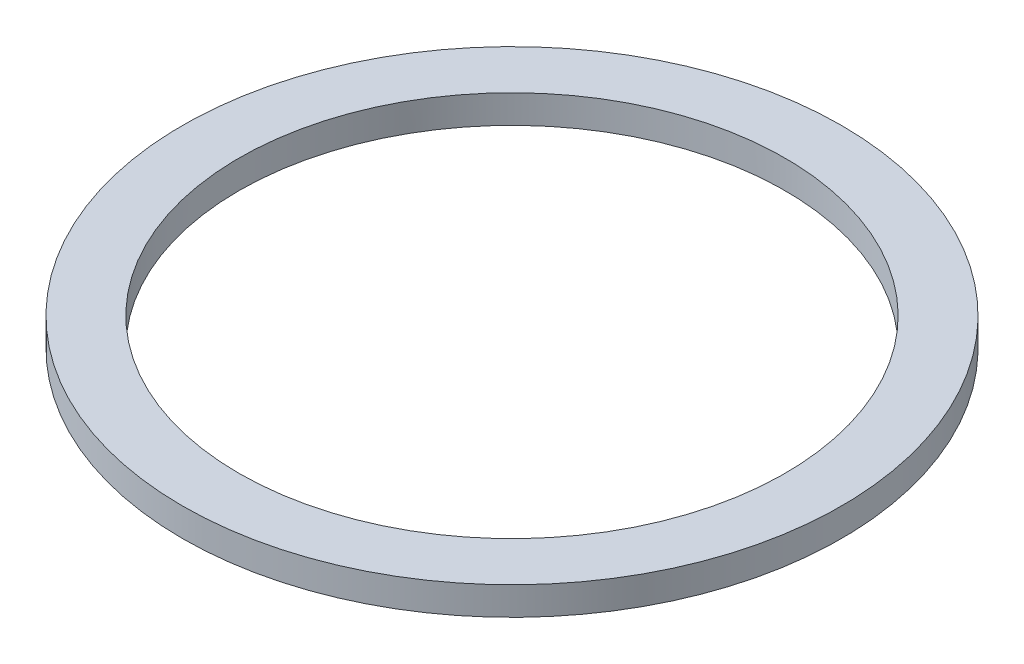
ISO-10303-21;
HEADER;
FILE_DESCRIPTION(('STEP AP214'),'2;1');
FILE_NAME('part.step','',(''),(''),'','','');
FILE_SCHEMA(('AUTOMOTIVE_DESIGN { 1 0 10303 214 1 1 1 1 }'));
ENDSEC;
DATA;
#1=APPLICATION_CONTEXT('core data for automotive mechanical design processes');
#2=APPLICATION_PROTOCOL_DEFINITION('international standard','automotive_design',2000,#1);
#3=PRODUCT_CONTEXT('',#1,'mechanical');
#4=PRODUCT('Part','Part','',(#3));
#5=PRODUCT_RELATED_PRODUCT_CATEGORY('part','',(#4));
#6=PRODUCT_DEFINITION_FORMATION('','',#4);
#7=PRODUCT_DEFINITION_CONTEXT('part definition',#1,'design');
#8=PRODUCT_DEFINITION('design','',#6,#7);
#9=PRODUCT_DEFINITION_SHAPE('','',#8);
#10=(LENGTH_UNIT() NAMED_UNIT(*) SI_UNIT(.MILLI.,.METRE.));
#11=(NAMED_UNIT(*) PLANE_ANGLE_UNIT() SI_UNIT($,.RADIAN.));
#12=(NAMED_UNIT(*) SI_UNIT($,.STERADIAN.) SOLID_ANGLE_UNIT());
#13=UNCERTAINTY_MEASURE_WITH_UNIT(LENGTH_MEASURE(1.E-05),#10,'distance_accuracy_value','');
#14=(GEOMETRIC_REPRESENTATION_CONTEXT(3) GLOBAL_UNCERTAINTY_ASSIGNED_CONTEXT((#13)) GLOBAL_UNIT_ASSIGNED_CONTEXT((#10,
#11,#12)) REPRESENTATION_CONTEXT('',''));
#15=CARTESIAN_POINT('',(0.,0.,0.));
#16=DIRECTION('',(0.,0.,1.));
#17=DIRECTION('',(1.,0.,0.));
#18=AXIS2_PLACEMENT_3D('',#15,#16,#17);
#19=CARTESIAN_POINT('',(12.9121769052674,15.,27.9358419776268));
#20=DIRECTION('',(0.,1.,0.));
#21=DIRECTION('',(0.892575946630033,0.,-0.450897083043904));
#22=AXIS2_PLACEMENT_3D('',#19,#20,#21);
#23=PLANE('',#22);
#24=CARTESIAN_POINT('',(-1.19999999984069,15.,0.));
#25=DIRECTION('',(0.,1.,0.));
#26=DIRECTION('',(-1.,0.,0.));
#27=AXIS2_PLACEMENT_3D('',#24,#25,#26);
#28=CIRCLE('',#27,29.);
#29=CARTESIAN_POINT('',(-30.1999999998407,15.,0.));
#30=VERTEX_POINT('',#29);
#31=EDGE_CURVE('E49',#30,#30,#28,.F.);
#32=ORIENTED_EDGE('',*,*,#31,.F.);
#33=EDGE_LOOP('',(#32));
#34=FACE_BOUND('',#33,.T.);
#35=CARTESIAN_POINT('',(-1.19999999997237,15.,0.));
#36=DIRECTION('',(0.,1.,0.));
#37=DIRECTION('',(0.,0.,1.));
#38=AXIS2_PLACEMENT_3D('',#35,#36,#37);
#39=CIRCLE('',#38,35.0000000001142);
#40=CARTESIAN_POINT('',(-1.19999999997237,15.,35.0000000001142));
#41=VERTEX_POINT('',#40);
#42=EDGE_CURVE('E10',#41,#41,#39,.T.);
#43=ORIENTED_EDGE('',*,*,#42,.F.);
#44=EDGE_LOOP('',(#43));
#45=FACE_BOUND('',#44,.T.);
#46=ADVANCED_FACE('F39',(#34,#45),#23,.F.);
#47=CARTESIAN_POINT('',(-1.19999999984069,18.,0.));
#48=DIRECTION('',(0.,1.,0.));
#49=DIRECTION('',(0.,0.,1.));
#50=AXIS2_PLACEMENT_3D('',#47,#48,#49);
#51=PLANE('',#50);
#52=CARTESIAN_POINT('',(-1.19999999984069,18.,0.));
#53=DIRECTION('',(0.,1.,0.));
#54=DIRECTION('',(0.,0.,1.));
#55=AXIS2_PLACEMENT_3D('',#52,#53,#54);
#56=CIRCLE('',#55,34.9999999999833);
#57=CARTESIAN_POINT('',(-1.19999999984069,18.,34.9999999999833));
#58=VERTEX_POINT('',#57);
#59=EDGE_CURVE('E46',#58,#58,#56,.T.);
#60=ORIENTED_EDGE('',*,*,#59,.T.);
#61=EDGE_LOOP('',(#60));
#62=FACE_BOUND('',#61,.T.);
#63=CARTESIAN_POINT('',(-1.19999999984069,18.,0.));
#64=DIRECTION('',(0.,1.,0.));
#65=DIRECTION('',(0.,0.,1.));
#66=AXIS2_PLACEMENT_3D('',#63,#64,#65);
#67=CIRCLE('',#66,29.);
#68=CARTESIAN_POINT('',(-1.19999999984069,18.,29.));
#69=VERTEX_POINT('',#68);
#70=EDGE_CURVE('E53',#69,#69,#67,.T.);
#71=ORIENTED_EDGE('',*,*,#70,.F.);
#72=EDGE_LOOP('',(#71));
#73=FACE_BOUND('',#72,.T.);
#74=ADVANCED_FACE('F64',(#62,#73),#51,.T.);
#75=CARTESIAN_POINT('',(-1.19999999984069,-83.9949493660693,0.));
#76=DIRECTION('',(0.,1.,0.));
#77=DIRECTION('',(0.,0.,1.));
#78=AXIS2_PLACEMENT_3D('',#75,#76,#77);
#79=CYLINDRICAL_SURFACE('',#78,29.);
#80=ORIENTED_EDGE('',*,*,#31,.T.);
#81=EDGE_LOOP('',(#80));
#82=FACE_BOUND('',#81,.T.);
#83=ORIENTED_EDGE('',*,*,#70,.T.);
#84=EDGE_LOOP('',(#83));
#85=FACE_BOUND('',#84,.T.);
#86=ADVANCED_FACE('F58',(#82,#85),#79,.F.);
#87=CARTESIAN_POINT('',(-1.19999999997237,-8.,0.));
#88=DIRECTION('',(0.,-1.,0.));
#89=DIRECTION('',(0.,0.,-1.));
#90=AXIS2_PLACEMENT_3D('',#87,#88,#89);
#91=CYLINDRICAL_SURFACE('',#90,35.0000000001142);
#92=ORIENTED_EDGE('',*,*,#42,.T.);
#93=EDGE_LOOP('',(#92));
#94=FACE_BOUND('',#93,.T.);
#95=ORIENTED_EDGE('',*,*,#59,.F.);
#96=EDGE_LOOP('',(#95));
#97=FACE_BOUND('',#96,.T.);
#98=ADVANCED_FACE('F41',(#94,#97),#91,.T.);
#99=CLOSED_SHELL('',(#46,#74,#86,#98));
#100=MANIFOLD_SOLID_BREP('B2',#99);
#101=ADVANCED_BREP_SHAPE_REPRESENTATION('',(#18,#100),#14);
#102=SHAPE_DEFINITION_REPRESENTATION(#9,#101);
ENDSEC;
END-ISO-10303-21;
